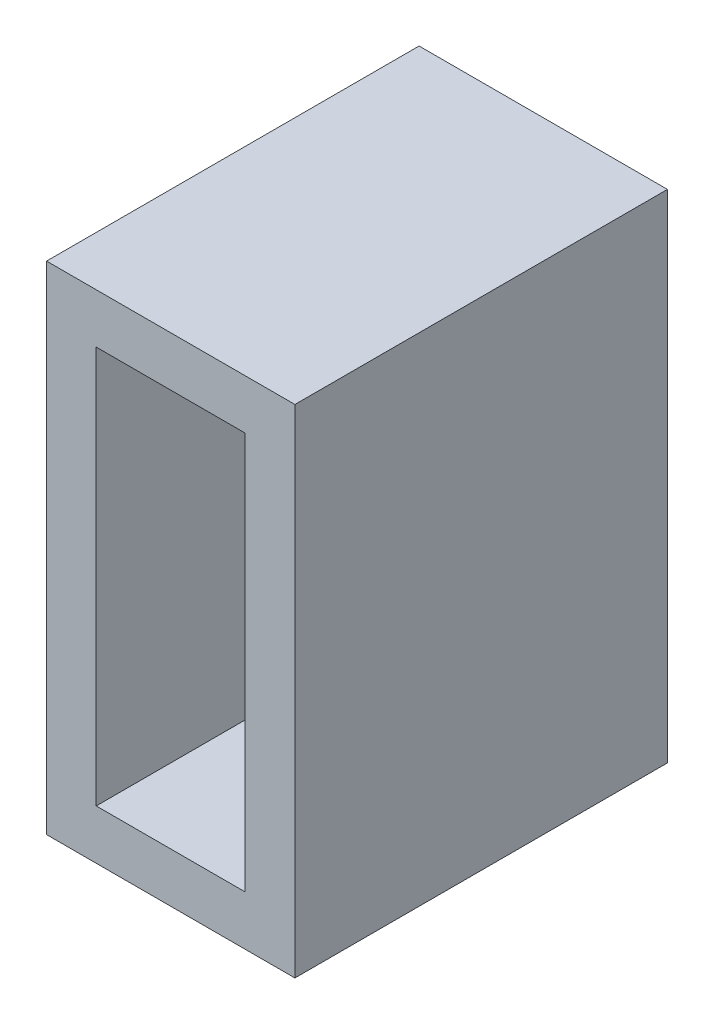
ISO-10303-21;
HEADER;
FILE_DESCRIPTION(('STEP AP214'),'2;1');
FILE_NAME('part.step','',(''),(''),'','','');
FILE_SCHEMA(('AUTOMOTIVE_DESIGN { 1 0 10303 214 1 1 1 1 }'));
ENDSEC;
DATA;
#1=APPLICATION_CONTEXT('core data for automotive mechanical design processes');
#2=APPLICATION_PROTOCOL_DEFINITION('international standard','automotive_design',2000,#1);
#3=PRODUCT_CONTEXT('',#1,'mechanical');
#4=PRODUCT('Part','Part','',(#3));
#5=PRODUCT_RELATED_PRODUCT_CATEGORY('part','',(#4));
#6=PRODUCT_DEFINITION_FORMATION('','',#4);
#7=PRODUCT_DEFINITION_CONTEXT('part definition',#1,'design');
#8=PRODUCT_DEFINITION('design','',#6,#7);
#9=PRODUCT_DEFINITION_SHAPE('','',#8);
#10=(LENGTH_UNIT() NAMED_UNIT(*) SI_UNIT(.MILLI.,.METRE.));
#11=(NAMED_UNIT(*) PLANE_ANGLE_UNIT() SI_UNIT($,.RADIAN.));
#12=(NAMED_UNIT(*) SI_UNIT($,.STERADIAN.) SOLID_ANGLE_UNIT());
#13=UNCERTAINTY_MEASURE_WITH_UNIT(LENGTH_MEASURE(1.E-05),#10,'distance_accuracy_value','');
#14=(GEOMETRIC_REPRESENTATION_CONTEXT(3) GLOBAL_UNCERTAINTY_ASSIGNED_CONTEXT((#13)) GLOBAL_UNIT_ASSIGNED_CONTEXT((#10,
#11,#12)) REPRESENTATION_CONTEXT('',''));
#15=CARTESIAN_POINT('',(0.,0.,0.));
#16=DIRECTION('',(0.,0.,1.));
#17=DIRECTION('',(1.,0.,0.));
#18=AXIS2_PLACEMENT_3D('',#15,#16,#17);
#19=CARTESIAN_POINT('',(0.,0.,38.1));
#20=DIRECTION('',(0.,0.,-1.));
#21=DIRECTION('',(-1.,0.,0.));
#22=AXIS2_PLACEMENT_3D('',#19,#20,#21);
#23=PLANE('',#22);
#24=DIRECTION('',(0.,1.,0.));
#25=VECTOR('',#24,1.);
#26=CARTESIAN_POINT('',(12.7,-25.4,38.1));
#27=LINE('',#26,#25);
#28=CARTESIAN_POINT('',(12.7,-25.4,38.1));
#29=VERTEX_POINT('',#28);
#30=CARTESIAN_POINT('',(12.7,25.4,38.1));
#31=VERTEX_POINT('',#30);
#32=EDGE_CURVE('E153',#29,#31,#27,.T.);
#33=ORIENTED_EDGE('',*,*,#32,.T.);
#34=DIRECTION('',(-1.,0.,0.));
#35=VECTOR('',#34,1.);
#36=CARTESIAN_POINT('',(-12.7,25.4,38.1));
#37=LINE('',#36,#35);
#38=CARTESIAN_POINT('',(-12.7,25.4,38.1));
#39=VERTEX_POINT('',#38);
#40=EDGE_CURVE('E157',#31,#39,#37,.T.);
#41=ORIENTED_EDGE('',*,*,#40,.T.);
#42=DIRECTION('',(0.,-1.,0.));
#43=VECTOR('',#42,1.);
#44=CARTESIAN_POINT('',(-12.7,-25.4,38.1));
#45=LINE('',#44,#43);
#46=CARTESIAN_POINT('',(-12.7,-25.4,38.1));
#47=VERTEX_POINT('',#46);
#48=EDGE_CURVE('E161',#39,#47,#45,.T.);
#49=ORIENTED_EDGE('',*,*,#48,.T.);
#50=DIRECTION('',(1.,0.,0.));
#51=VECTOR('',#50,1.);
#52=CARTESIAN_POINT('',(-12.7,-25.4,38.1));
#53=LINE('',#52,#51);
#54=EDGE_CURVE('E164',#47,#29,#53,.T.);
#55=ORIENTED_EDGE('',*,*,#54,.T.);
#56=EDGE_LOOP('',(#33,#41,#49,#55));
#57=FACE_BOUND('',#56,.T.);
#58=DIRECTION('',(0.,1.,0.));
#59=VECTOR('',#58,1.);
#60=CARTESIAN_POINT('',(7.62,-20.32,38.1));
#61=LINE('',#60,#59);
#62=CARTESIAN_POINT('',(7.62,-20.32,38.1));
#63=VERTEX_POINT('',#62);
#64=CARTESIAN_POINT('',(7.62,20.32,38.1));
#65=VERTEX_POINT('',#64);
#66=EDGE_CURVE('E105',#63,#65,#61,.T.);
#67=ORIENTED_EDGE('',*,*,#66,.F.);
#68=DIRECTION('',(1.,0.,0.));
#69=VECTOR('',#68,1.);
#70=CARTESIAN_POINT('',(-7.62,-20.32,38.1));
#71=LINE('',#70,#69);
#72=CARTESIAN_POINT('',(-7.62,-20.32,38.1));
#73=VERTEX_POINT('',#72);
#74=EDGE_CURVE('E131',#73,#63,#71,.T.);
#75=ORIENTED_EDGE('',*,*,#74,.F.);
#76=DIRECTION('',(0.,-1.,0.));
#77=VECTOR('',#76,1.);
#78=CARTESIAN_POINT('',(-7.62,-20.32,38.1));
#79=LINE('',#78,#77);
#80=CARTESIAN_POINT('',(-7.62,20.32,38.1));
#81=VERTEX_POINT('',#80);
#82=EDGE_CURVE('E127',#81,#73,#79,.T.);
#83=ORIENTED_EDGE('',*,*,#82,.F.);
#84=DIRECTION('',(-1.,0.,0.));
#85=VECTOR('',#84,1.);
#86=CARTESIAN_POINT('',(-7.62,20.32,38.1));
#87=LINE('',#86,#85);
#88=EDGE_CURVE('E114',#65,#81,#87,.T.);
#89=ORIENTED_EDGE('',*,*,#88,.F.);
#90=EDGE_LOOP('',(#67,#75,#83,#89));
#91=FACE_BOUND('',#90,.T.);
#92=ADVANCED_FACE('F39',(#57,#91),#23,.F.);
#93=CARTESIAN_POINT('',(0.,0.,0.));
#94=DIRECTION('',(0.,0.,-1.));
#95=DIRECTION('',(-1.,0.,0.));
#96=AXIS2_PLACEMENT_3D('',#93,#94,#95);
#97=PLANE('',#96);
#98=DIRECTION('',(0.,1.,0.));
#99=VECTOR('',#98,1.);
#100=CARTESIAN_POINT('',(12.7,-25.4,0.));
#101=LINE('',#100,#99);
#102=CARTESIAN_POINT('',(12.7,-25.4,0.));
#103=VERTEX_POINT('',#102);
#104=CARTESIAN_POINT('',(12.7,25.4,0.));
#105=VERTEX_POINT('',#104);
#106=EDGE_CURVE('E123',#103,#105,#101,.T.);
#107=ORIENTED_EDGE('',*,*,#106,.F.);
#108=DIRECTION('',(1.,0.,0.));
#109=VECTOR('',#108,1.);
#110=CARTESIAN_POINT('',(-12.7,-25.4,0.));
#111=LINE('',#110,#109);
#112=CARTESIAN_POINT('',(-12.7,-25.4,0.));
#113=VERTEX_POINT('',#112);
#114=EDGE_CURVE('E158',#113,#103,#111,.T.);
#115=ORIENTED_EDGE('',*,*,#114,.F.);
#116=DIRECTION('',(0.,-1.,0.));
#117=VECTOR('',#116,1.);
#118=CARTESIAN_POINT('',(-12.7,-25.4,0.));
#119=LINE('',#118,#117);
#120=CARTESIAN_POINT('',(-12.7,25.4,0.));
#121=VERTEX_POINT('',#120);
#122=EDGE_CURVE('E174',#121,#113,#119,.T.);
#123=ORIENTED_EDGE('',*,*,#122,.F.);
#124=DIRECTION('',(-1.,0.,0.));
#125=VECTOR('',#124,1.);
#126=CARTESIAN_POINT('',(-12.7,25.4,0.));
#127=LINE('',#126,#125);
#128=EDGE_CURVE('E171',#105,#121,#127,.T.);
#129=ORIENTED_EDGE('',*,*,#128,.F.);
#130=EDGE_LOOP('',(#107,#115,#123,#129));
#131=FACE_BOUND('',#130,.T.);
#132=DIRECTION('',(1.,0.,0.));
#133=VECTOR('',#132,1.);
#134=CARTESIAN_POINT('',(-7.62,-20.32,0.));
#135=LINE('',#134,#133);
#136=CARTESIAN_POINT('',(-7.62,-20.32,0.));
#137=VERTEX_POINT('',#136);
#138=CARTESIAN_POINT('',(7.62,-20.32,0.));
#139=VERTEX_POINT('',#138);
#140=EDGE_CURVE('E115',#137,#139,#135,.T.);
#141=ORIENTED_EDGE('',*,*,#140,.T.);
#142=DIRECTION('',(0.,1.,0.));
#143=VECTOR('',#142,1.);
#144=CARTESIAN_POINT('',(7.62,-20.32,0.));
#145=LINE('',#144,#143);
#146=CARTESIAN_POINT('',(7.62,20.32,0.));
#147=VERTEX_POINT('',#146);
#148=EDGE_CURVE('E63',#139,#147,#145,.T.);
#149=ORIENTED_EDGE('',*,*,#148,.T.);
#150=DIRECTION('',(-1.,0.,0.));
#151=VECTOR('',#150,1.);
#152=CARTESIAN_POINT('',(-7.62,20.32,0.));
#153=LINE('',#152,#151);
#154=CARTESIAN_POINT('',(-7.62,20.32,0.));
#155=VERTEX_POINT('',#154);
#156=EDGE_CURVE('E121',#147,#155,#153,.T.);
#157=ORIENTED_EDGE('',*,*,#156,.T.);
#158=DIRECTION('',(0.,-1.,0.));
#159=VECTOR('',#158,1.);
#160=CARTESIAN_POINT('',(-7.62,-20.32,0.));
#161=LINE('',#160,#159);
#162=EDGE_CURVE('E140',#155,#137,#161,.T.);
#163=ORIENTED_EDGE('',*,*,#162,.T.);
#164=EDGE_LOOP('',(#141,#149,#157,#163));
#165=FACE_BOUND('',#164,.T.);
#166=ADVANCED_FACE('F197',(#131,#165),#97,.T.);
#167=CARTESIAN_POINT('',(12.7,-25.4,38.1));
#168=DIRECTION('',(-1.,0.,0.));
#169=DIRECTION('',(0.,0.,1.));
#170=AXIS2_PLACEMENT_3D('',#167,#168,#169);
#171=PLANE('',#170);
#172=ORIENTED_EDGE('',*,*,#106,.T.);
#173=DIRECTION('',(0.,0.,-1.));
#174=VECTOR('',#173,1.);
#175=CARTESIAN_POINT('',(12.7,25.4,38.1));
#176=LINE('',#175,#174);
#177=EDGE_CURVE('E11',#31,#105,#176,.T.);
#178=ORIENTED_EDGE('',*,*,#177,.F.);
#179=ORIENTED_EDGE('',*,*,#32,.F.);
#180=DIRECTION('',(0.,0.,-1.));
#181=VECTOR('',#180,1.);
#182=CARTESIAN_POINT('',(12.7,-25.4,38.1));
#183=LINE('',#182,#181);
#184=EDGE_CURVE('E167',#29,#103,#183,.T.);
#185=ORIENTED_EDGE('',*,*,#184,.T.);
#186=EDGE_LOOP('',(#172,#178,#179,#185));
#187=FACE_BOUND('',#186,.T.);
#188=ADVANCED_FACE('F41',(#187),#171,.F.);
#189=CARTESIAN_POINT('',(-12.7,25.4,38.1));
#190=DIRECTION('',(0.,-1.,0.));
#191=DIRECTION('',(0.,0.,-1.));
#192=AXIS2_PLACEMENT_3D('',#189,#190,#191);
#193=PLANE('',#192);
#194=ORIENTED_EDGE('',*,*,#128,.T.);
#195=DIRECTION('',(0.,0.,-1.));
#196=VECTOR('',#195,1.);
#197=CARTESIAN_POINT('',(-12.7,25.4,38.1));
#198=LINE('',#197,#196);
#199=EDGE_CURVE('E48',#39,#121,#198,.T.);
#200=ORIENTED_EDGE('',*,*,#199,.F.);
#201=ORIENTED_EDGE('',*,*,#40,.F.);
#202=ORIENTED_EDGE('',*,*,#177,.T.);
#203=EDGE_LOOP('',(#194,#200,#201,#202));
#204=FACE_BOUND('',#203,.T.);
#205=ADVANCED_FACE('F207',(#204),#193,.F.);
#206=CARTESIAN_POINT('',(-12.7,-25.4,38.1));
#207=DIRECTION('',(1.,0.,0.));
#208=DIRECTION('',(0.,0.,-1.));
#209=AXIS2_PLACEMENT_3D('',#206,#207,#208);
#210=PLANE('',#209);
#211=ORIENTED_EDGE('',*,*,#122,.T.);
#212=DIRECTION('',(0.,0.,-1.));
#213=VECTOR('',#212,1.);
#214=CARTESIAN_POINT('',(-12.7,-25.4,38.1));
#215=LINE('',#214,#213);
#216=EDGE_CURVE('E182',#47,#113,#215,.T.);
#217=ORIENTED_EDGE('',*,*,#216,.F.);
#218=ORIENTED_EDGE('',*,*,#48,.F.);
#219=ORIENTED_EDGE('',*,*,#199,.T.);
#220=EDGE_LOOP('',(#211,#217,#218,#219));
#221=FACE_BOUND('',#220,.T.);
#222=ADVANCED_FACE('F191',(#221),#210,.F.);
#223=CARTESIAN_POINT('',(-12.7,-25.4,38.1));
#224=DIRECTION('',(0.,1.,0.));
#225=DIRECTION('',(0.,0.,1.));
#226=AXIS2_PLACEMENT_3D('',#223,#224,#225);
#227=PLANE('',#226);
#228=ORIENTED_EDGE('',*,*,#114,.T.);
#229=ORIENTED_EDGE('',*,*,#184,.F.);
#230=ORIENTED_EDGE('',*,*,#54,.F.);
#231=ORIENTED_EDGE('',*,*,#216,.T.);
#232=EDGE_LOOP('',(#228,#229,#230,#231));
#233=FACE_BOUND('',#232,.T.);
#234=ADVANCED_FACE('F201',(#233),#227,.F.);
#235=CARTESIAN_POINT('',(7.62,-20.32,38.1));
#236=DIRECTION('',(-1.,0.,0.));
#237=DIRECTION('',(0.,0.,1.));
#238=AXIS2_PLACEMENT_3D('',#235,#236,#237);
#239=PLANE('',#238);
#240=ORIENTED_EDGE('',*,*,#148,.F.);
#241=DIRECTION('',(0.,0.,-1.));
#242=VECTOR('',#241,1.);
#243=CARTESIAN_POINT('',(7.62,-20.32,38.1));
#244=LINE('',#243,#242);
#245=EDGE_CURVE('E109',#63,#139,#244,.T.);
#246=ORIENTED_EDGE('',*,*,#245,.F.);
#247=ORIENTED_EDGE('',*,*,#66,.T.);
#248=DIRECTION('',(0.,0.,-1.));
#249=VECTOR('',#248,1.);
#250=CARTESIAN_POINT('',(7.62,20.32,38.1));
#251=LINE('',#250,#249);
#252=EDGE_CURVE('E108',#65,#147,#251,.T.);
#253=ORIENTED_EDGE('',*,*,#252,.T.);
#254=EDGE_LOOP('',(#240,#246,#247,#253));
#255=FACE_BOUND('',#254,.T.);
#256=ADVANCED_FACE('F107',(#255),#239,.T.);
#257=CARTESIAN_POINT('',(-7.62,20.32,38.1));
#258=DIRECTION('',(0.,-1.,0.));
#259=DIRECTION('',(0.,0.,-1.));
#260=AXIS2_PLACEMENT_3D('',#257,#258,#259);
#261=PLANE('',#260);
#262=ORIENTED_EDGE('',*,*,#156,.F.);
#263=ORIENTED_EDGE('',*,*,#252,.F.);
#264=ORIENTED_EDGE('',*,*,#88,.T.);
#265=DIRECTION('',(0.,0.,-1.));
#266=VECTOR('',#265,1.);
#267=CARTESIAN_POINT('',(-7.62,20.32,38.1));
#268=LINE('',#267,#266);
#269=EDGE_CURVE('E124',#81,#155,#268,.T.);
#270=ORIENTED_EDGE('',*,*,#269,.T.);
#271=EDGE_LOOP('',(#262,#263,#264,#270));
#272=FACE_BOUND('',#271,.T.);
#273=ADVANCED_FACE('F118',(#272),#261,.T.);
#274=CARTESIAN_POINT('',(-7.62,-20.32,38.1));
#275=DIRECTION('',(1.,0.,0.));
#276=DIRECTION('',(0.,0.,-1.));
#277=AXIS2_PLACEMENT_3D('',#274,#275,#276);
#278=PLANE('',#277);
#279=ORIENTED_EDGE('',*,*,#162,.F.);
#280=ORIENTED_EDGE('',*,*,#269,.F.);
#281=ORIENTED_EDGE('',*,*,#82,.T.);
#282=DIRECTION('',(0.,0.,-1.));
#283=VECTOR('',#282,1.);
#284=CARTESIAN_POINT('',(-7.62,-20.32,38.1));
#285=LINE('',#284,#283);
#286=EDGE_CURVE('E55',#73,#137,#285,.T.);
#287=ORIENTED_EDGE('',*,*,#286,.T.);
#288=EDGE_LOOP('',(#279,#280,#281,#287));
#289=FACE_BOUND('',#288,.T.);
#290=ADVANCED_FACE('F230',(#289),#278,.T.);
#291=CARTESIAN_POINT('',(-7.62,-20.32,38.1));
#292=DIRECTION('',(0.,1.,0.));
#293=DIRECTION('',(0.,0.,1.));
#294=AXIS2_PLACEMENT_3D('',#291,#292,#293);
#295=PLANE('',#294);
#296=ORIENTED_EDGE('',*,*,#140,.F.);
#297=ORIENTED_EDGE('',*,*,#286,.F.);
#298=ORIENTED_EDGE('',*,*,#74,.T.);
#299=ORIENTED_EDGE('',*,*,#245,.T.);
#300=EDGE_LOOP('',(#296,#297,#298,#299));
#301=FACE_BOUND('',#300,.T.);
#302=ADVANCED_FACE('F234',(#301),#295,.T.);
#303=CLOSED_SHELL('',(#92,#166,#188,#205,#222,#234,#256,#273,#290,#302));
#304=MANIFOLD_SOLID_BREP('B2',#303);
#305=ADVANCED_BREP_SHAPE_REPRESENTATION('',(#18,#304),#14);
#306=SHAPE_DEFINITION_REPRESENTATION(#9,#305);
ENDSEC;
END-ISO-10303-21;
